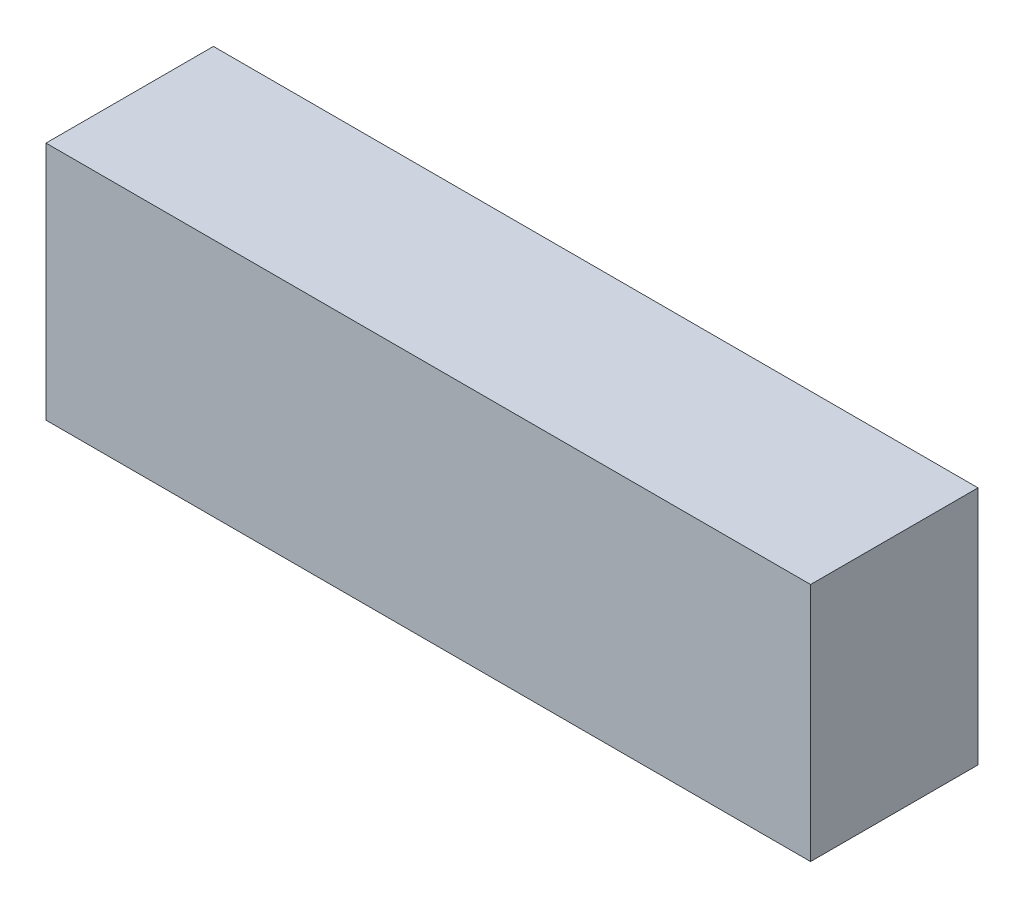
ISO-10303-21;
HEADER;
FILE_DESCRIPTION(('STEP AP214'),'2;1');
FILE_NAME('part.step','',(''),(''),'','','');
FILE_SCHEMA(('AUTOMOTIVE_DESIGN { 1 0 10303 214 1 1 1 1 }'));
ENDSEC;
DATA;
#1=APPLICATION_CONTEXT('core data for automotive mechanical design processes');
#2=APPLICATION_PROTOCOL_DEFINITION('international standard','automotive_design',2000,#1);
#3=PRODUCT_CONTEXT('',#1,'mechanical');
#4=PRODUCT('Part','Part','',(#3));
#5=PRODUCT_RELATED_PRODUCT_CATEGORY('part','',(#4));
#6=PRODUCT_DEFINITION_FORMATION('','',#4);
#7=PRODUCT_DEFINITION_CONTEXT('part definition',#1,'design');
#8=PRODUCT_DEFINITION('design','',#6,#7);
#9=PRODUCT_DEFINITION_SHAPE('','',#8);
#10=(LENGTH_UNIT() NAMED_UNIT(*) SI_UNIT(.MILLI.,.METRE.));
#11=(NAMED_UNIT(*) PLANE_ANGLE_UNIT() SI_UNIT($,.RADIAN.));
#12=(NAMED_UNIT(*) SI_UNIT($,.STERADIAN.) SOLID_ANGLE_UNIT());
#13=UNCERTAINTY_MEASURE_WITH_UNIT(LENGTH_MEASURE(1.E-05),#10,'distance_accuracy_value','');
#14=(GEOMETRIC_REPRESENTATION_CONTEXT(3) GLOBAL_UNCERTAINTY_ASSIGNED_CONTEXT((#13)) GLOBAL_UNIT_ASSIGNED_CONTEXT((#10,
#11,#12)) REPRESENTATION_CONTEXT('',''));
#15=CARTESIAN_POINT('',(0.,0.,0.));
#16=DIRECTION('',(0.,0.,1.));
#17=DIRECTION('',(1.,0.,0.));
#18=AXIS2_PLACEMENT_3D('',#15,#16,#17);
#19=CARTESIAN_POINT('',(0.,0.,30.));
#20=DIRECTION('',(1.,0.,0.));
#21=DIRECTION('',(0.,0.,-1.));
#22=AXIS2_PLACEMENT_3D('',#19,#20,#21);
#23=PLANE('',#22);
#24=DIRECTION('',(0.,-1.,0.));
#25=VECTOR('',#24,1.);
#26=CARTESIAN_POINT('',(0.,0.,0.));
#27=LINE('',#26,#25);
#28=CARTESIAN_POINT('',(0.,43.,0.));
#29=VERTEX_POINT('',#28);
#30=CARTESIAN_POINT('',(0.,0.,0.));
#31=VERTEX_POINT('',#30);
#32=EDGE_CURVE('E111',#29,#31,#27,.T.);
#33=ORIENTED_EDGE('',*,*,#32,.T.);
#34=DIRECTION('',(0.,0.,-1.));
#35=VECTOR('',#34,1.);
#36=CARTESIAN_POINT('',(0.,0.,30.));
#37=LINE('',#36,#35);
#38=CARTESIAN_POINT('',(0.,0.,30.));
#39=VERTEX_POINT('',#38);
#40=EDGE_CURVE('E11',#39,#31,#37,.T.);
#41=ORIENTED_EDGE('',*,*,#40,.F.);
#42=DIRECTION('',(0.,-1.,0.));
#43=VECTOR('',#42,1.);
#44=CARTESIAN_POINT('',(0.,0.,30.));
#45=LINE('',#44,#43);
#46=CARTESIAN_POINT('',(0.,43.,30.));
#47=VERTEX_POINT('',#46);
#48=EDGE_CURVE('E93',#47,#39,#45,.T.);
#49=ORIENTED_EDGE('',*,*,#48,.F.);
#50=DIRECTION('',(0.,0.,-1.));
#51=VECTOR('',#50,1.);
#52=CARTESIAN_POINT('',(0.,43.,30.));
#53=LINE('',#52,#51);
#54=EDGE_CURVE('E107',#47,#29,#53,.T.);
#55=ORIENTED_EDGE('',*,*,#54,.T.);
#56=EDGE_LOOP('',(#33,#41,#49,#55));
#57=FACE_BOUND('',#56,.T.);
#58=ADVANCED_FACE('F41',(#57),#23,.F.);
#59=CARTESIAN_POINT('',(0.,0.,30.));
#60=DIRECTION('',(0.,1.,0.));
#61=DIRECTION('',(0.,0.,1.));
#62=AXIS2_PLACEMENT_3D('',#59,#60,#61);
#63=PLANE('',#62);
#64=DIRECTION('',(1.,0.,0.));
#65=VECTOR('',#64,1.);
#66=CARTESIAN_POINT('',(0.,0.,0.));
#67=LINE('',#66,#65);
#68=CARTESIAN_POINT('',(137.,0.,0.));
#69=VERTEX_POINT('',#68);
#70=EDGE_CURVE('E98',#31,#69,#67,.T.);
#71=ORIENTED_EDGE('',*,*,#70,.T.);
#72=DIRECTION('',(0.,0.,-1.));
#73=VECTOR('',#72,1.);
#74=CARTESIAN_POINT('',(137.,0.,30.));
#75=LINE('',#74,#73);
#76=CARTESIAN_POINT('',(137.,0.,30.));
#77=VERTEX_POINT('',#76);
#78=EDGE_CURVE('E50',#77,#69,#75,.T.);
#79=ORIENTED_EDGE('',*,*,#78,.F.);
#80=DIRECTION('',(1.,0.,0.));
#81=VECTOR('',#80,1.);
#82=CARTESIAN_POINT('',(0.,0.,30.));
#83=LINE('',#82,#81);
#84=EDGE_CURVE('E88',#39,#77,#83,.T.);
#85=ORIENTED_EDGE('',*,*,#84,.F.);
#86=ORIENTED_EDGE('',*,*,#40,.T.);
#87=EDGE_LOOP('',(#71,#79,#85,#86));
#88=FACE_BOUND('',#87,.T.);
#89=ADVANCED_FACE('F97',(#88),#63,.F.);
#90=CARTESIAN_POINT('',(137.,0.,30.));
#91=DIRECTION('',(-1.,0.,0.));
#92=DIRECTION('',(0.,0.,1.));
#93=AXIS2_PLACEMENT_3D('',#90,#91,#92);
#94=PLANE('',#93);
#95=DIRECTION('',(0.,1.,0.));
#96=VECTOR('',#95,1.);
#97=CARTESIAN_POINT('',(137.,0.,0.));
#98=LINE('',#97,#96);
#99=CARTESIAN_POINT('',(137.,43.,0.));
#100=VERTEX_POINT('',#99);
#101=EDGE_CURVE('E75',#69,#100,#98,.T.);
#102=ORIENTED_EDGE('',*,*,#101,.T.);
#103=DIRECTION('',(0.,0.,-1.));
#104=VECTOR('',#103,1.);
#105=CARTESIAN_POINT('',(137.,43.,30.));
#106=LINE('',#105,#104);
#107=CARTESIAN_POINT('',(137.,43.,30.));
#108=VERTEX_POINT('',#107);
#109=EDGE_CURVE('E100',#108,#100,#106,.T.);
#110=ORIENTED_EDGE('',*,*,#109,.F.);
#111=DIRECTION('',(0.,1.,0.));
#112=VECTOR('',#111,1.);
#113=CARTESIAN_POINT('',(137.,0.,30.));
#114=LINE('',#113,#112);
#115=EDGE_CURVE('E91',#77,#108,#114,.T.);
#116=ORIENTED_EDGE('',*,*,#115,.F.);
#117=ORIENTED_EDGE('',*,*,#78,.T.);
#118=EDGE_LOOP('',(#102,#110,#116,#117));
#119=FACE_BOUND('',#118,.T.);
#120=ADVANCED_FACE('F101',(#119),#94,.F.);
#121=CARTESIAN_POINT('',(0.,43.,30.));
#122=DIRECTION('',(0.,-1.,0.));
#123=DIRECTION('',(0.,0.,-1.));
#124=AXIS2_PLACEMENT_3D('',#121,#122,#123);
#125=PLANE('',#124);
#126=DIRECTION('',(-1.,0.,0.));
#127=VECTOR('',#126,1.);
#128=CARTESIAN_POINT('',(0.,43.,0.));
#129=LINE('',#128,#127);
#130=EDGE_CURVE('E81',#100,#29,#129,.T.);
#131=ORIENTED_EDGE('',*,*,#130,.T.);
#132=ORIENTED_EDGE('',*,*,#54,.F.);
#133=DIRECTION('',(-1.,0.,0.));
#134=VECTOR('',#133,1.);
#135=CARTESIAN_POINT('',(0.,43.,30.));
#136=LINE('',#135,#134);
#137=EDGE_CURVE('E58',#108,#47,#136,.T.);
#138=ORIENTED_EDGE('',*,*,#137,.F.);
#139=ORIENTED_EDGE('',*,*,#109,.T.);
#140=EDGE_LOOP('',(#131,#132,#138,#139));
#141=FACE_BOUND('',#140,.T.);
#142=ADVANCED_FACE('F126',(#141),#125,.F.);
#143=CARTESIAN_POINT('',(0.,0.,30.));
#144=DIRECTION('',(0.,0.,-1.));
#145=DIRECTION('',(-1.,0.,0.));
#146=AXIS2_PLACEMENT_3D('',#143,#144,#145);
#147=PLANE('',#146);
#148=ORIENTED_EDGE('',*,*,#48,.T.);
#149=ORIENTED_EDGE('',*,*,#84,.T.);
#150=ORIENTED_EDGE('',*,*,#115,.T.);
#151=ORIENTED_EDGE('',*,*,#137,.T.);
#152=EDGE_LOOP('',(#148,#149,#150,#151));
#153=FACE_BOUND('',#152,.T.);
#154=ADVANCED_FACE('F89',(#153),#147,.F.);
#155=CARTESIAN_POINT('',(0.,0.,0.));
#156=DIRECTION('',(0.,0.,-1.));
#157=DIRECTION('',(-1.,0.,0.));
#158=AXIS2_PLACEMENT_3D('',#155,#156,#157);
#159=PLANE('',#158);
#160=ORIENTED_EDGE('',*,*,#32,.F.);
#161=ORIENTED_EDGE('',*,*,#130,.F.);
#162=ORIENTED_EDGE('',*,*,#101,.F.);
#163=ORIENTED_EDGE('',*,*,#70,.F.);
#164=EDGE_LOOP('',(#160,#161,#162,#163));
#165=FACE_BOUND('',#164,.T.);
#166=ADVANCED_FACE('F129',(#165),#159,.T.);
#167=CLOSED_SHELL('',(#58,#89,#120,#142,#154,#166));
#168=MANIFOLD_SOLID_BREP('B2',#167);
#169=ADVANCED_BREP_SHAPE_REPRESENTATION('',(#18,#168),#14);
#170=SHAPE_DEFINITION_REPRESENTATION(#9,#169);
ENDSEC;
END-ISO-10303-21;
